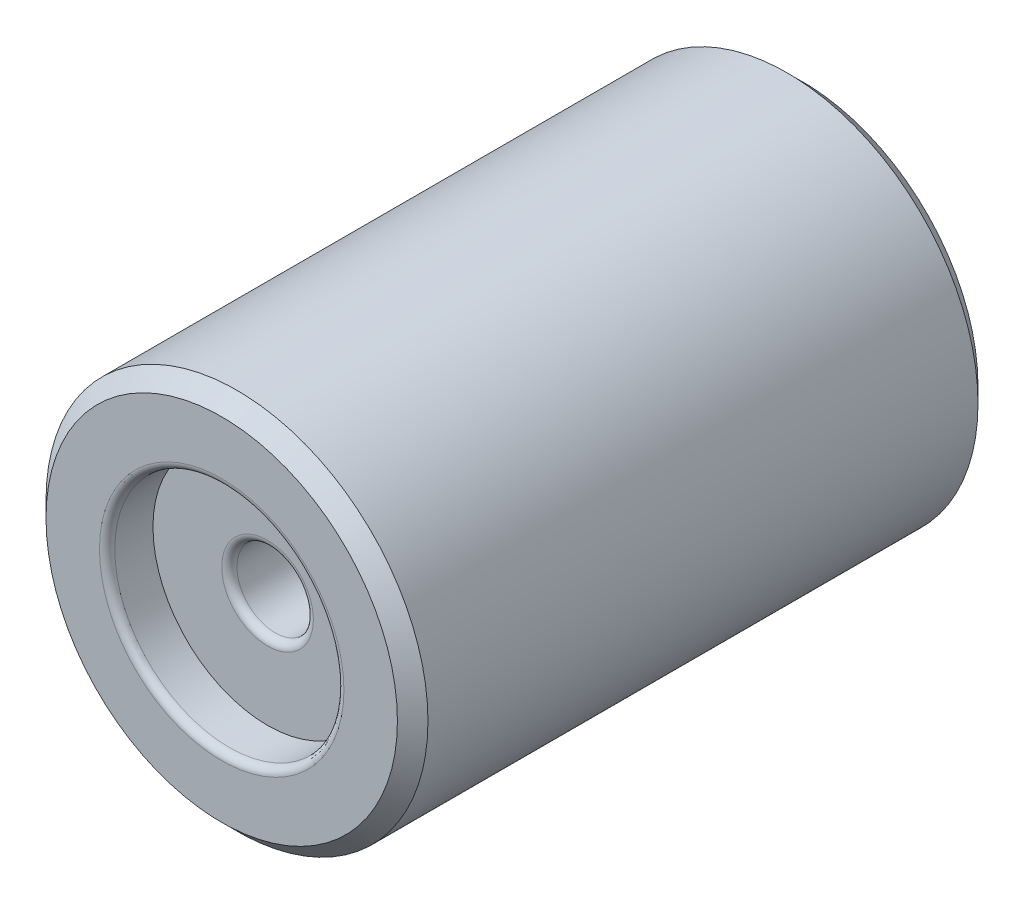
ISO-10303-21;
HEADER;
FILE_DESCRIPTION(('STEP AP214'),'2;1');
FILE_NAME('part.step','',(''),(''),'','','');
FILE_SCHEMA(('AUTOMOTIVE_DESIGN { 1 0 10303 214 1 1 1 1 }'));
ENDSEC;
DATA;
#1=APPLICATION_CONTEXT('core data for automotive mechanical design processes');
#2=APPLICATION_PROTOCOL_DEFINITION('international standard','automotive_design',2000,#1);
#3=PRODUCT_CONTEXT('',#1,'mechanical');
#4=PRODUCT('Part','Part','',(#3));
#5=PRODUCT_RELATED_PRODUCT_CATEGORY('part','',(#4));
#6=PRODUCT_DEFINITION_FORMATION('','',#4);
#7=PRODUCT_DEFINITION_CONTEXT('part definition',#1,'design');
#8=PRODUCT_DEFINITION('design','',#6,#7);
#9=PRODUCT_DEFINITION_SHAPE('','',#8);
#10=(LENGTH_UNIT() NAMED_UNIT(*) SI_UNIT(.MILLI.,.METRE.));
#11=(NAMED_UNIT(*) PLANE_ANGLE_UNIT() SI_UNIT($,.RADIAN.));
#12=(NAMED_UNIT(*) SI_UNIT($,.STERADIAN.) SOLID_ANGLE_UNIT());
#13=UNCERTAINTY_MEASURE_WITH_UNIT(LENGTH_MEASURE(1.E-05),#10,'distance_accuracy_value','');
#14=(GEOMETRIC_REPRESENTATION_CONTEXT(3) GLOBAL_UNCERTAINTY_ASSIGNED_CONTEXT((#13)) GLOBAL_UNIT_ASSIGNED_CONTEXT((#10,
#11,#12)) REPRESENTATION_CONTEXT('',''));
#15=CARTESIAN_POINT('',(0.,0.,0.));
#16=DIRECTION('',(0.,0.,1.));
#17=DIRECTION('',(1.,0.,0.));
#18=AXIS2_PLACEMENT_3D('',#15,#16,#17);
#19=CARTESIAN_POINT('',(0.,0.,19.));
#20=DIRECTION('',(0.,0.,-1.));
#21=DIRECTION('',(-1.,0.,0.));
#22=AXIS2_PLACEMENT_3D('',#19,#20,#21);
#23=CYLINDRICAL_SURFACE('',#22,7.5);
#24=CARTESIAN_POINT('',(0.,0.,-16.5));
#25=DIRECTION('',(0.,0.,1.));
#26=DIRECTION('',(1.,0.,0.));
#27=AXIS2_PLACEMENT_3D('',#24,#25,#26);
#28=CIRCLE('',#27,7.5);
#29=CARTESIAN_POINT('',(7.5,0.,-16.5));
#30=VERTEX_POINT('',#29);
#31=EDGE_CURVE('E65',#30,#30,#28,.T.);
#32=ORIENTED_EDGE('',*,*,#31,.T.);
#33=EDGE_LOOP('',(#32));
#34=FACE_BOUND('',#33,.T.);
#35=CARTESIAN_POINT('',(0.,0.,-18.5));
#36=DIRECTION('',(0.,0.,1.));
#37=DIRECTION('',(1.,0.,0.));
#38=AXIS2_PLACEMENT_3D('',#35,#36,#37);
#39=CIRCLE('',#38,7.5);
#40=CARTESIAN_POINT('',(7.5,0.,-18.5));
#41=VERTEX_POINT('',#40);
#42=EDGE_CURVE('E62',#41,#41,#39,.F.);
#43=ORIENTED_EDGE('',*,*,#42,.T.);
#44=EDGE_LOOP('',(#43));
#45=FACE_BOUND('',#44,.T.);
#46=ADVANCED_FACE('F39',(#34,#45),#23,.F.);
#47=CARTESIAN_POINT('',(0.,0.,18.5));
#48=DIRECTION('',(0.,0.,1.));
#49=DIRECTION('',(1.,0.,0.));
#50=AXIS2_PLACEMENT_3D('',#47,#48,#49);
#51=CIRCLE('',#50,7.5);
#52=CARTESIAN_POINT('',(7.5,0.,18.5));
#53=VERTEX_POINT('',#52);
#54=EDGE_CURVE('E53',#53,#53,#51,.T.);
#55=ORIENTED_EDGE('',*,*,#54,.T.);
#56=EDGE_LOOP('',(#55));
#57=FACE_BOUND('',#56,.T.);
#58=CARTESIAN_POINT('',(0.,0.,16.));
#59=DIRECTION('',(0.,0.,1.));
#60=DIRECTION('',(1.,0.,0.));
#61=AXIS2_PLACEMENT_3D('',#58,#59,#60);
#62=CIRCLE('',#61,7.5);
#63=CARTESIAN_POINT('',(7.5,0.,16.));
#64=VERTEX_POINT('',#63);
#65=EDGE_CURVE('E90',#64,#64,#62,.T.);
#66=ORIENTED_EDGE('',*,*,#65,.F.);
#67=EDGE_LOOP('',(#66));
#68=FACE_BOUND('',#67,.T.);
#69=ADVANCED_FACE('F92',(#57,#68),#23,.F.);
#70=CARTESIAN_POINT('',(0.,0.,19.));
#71=DIRECTION('',(0.,0.,-1.));
#72=DIRECTION('',(-1.,0.,0.));
#73=AXIS2_PLACEMENT_3D('',#70,#71,#72);
#74=CYLINDRICAL_SURFACE('',#73,12.5);
#75=CARTESIAN_POINT('',(0.,0.,18.));
#76=DIRECTION('',(0.,0.,1.));
#77=DIRECTION('',(1.,0.,0.));
#78=AXIS2_PLACEMENT_3D('',#75,#76,#77);
#79=CIRCLE('',#78,12.5);
#80=CARTESIAN_POINT('',(12.5,0.,18.));
#81=VERTEX_POINT('',#80);
#82=EDGE_CURVE('E77',#81,#81,#79,.F.);
#83=ORIENTED_EDGE('',*,*,#82,.T.);
#84=EDGE_LOOP('',(#83));
#85=FACE_BOUND('',#84,.T.);
#86=CARTESIAN_POINT('',(0.,0.,-18.));
#87=DIRECTION('',(0.,0.,1.));
#88=DIRECTION('',(1.,0.,0.));
#89=AXIS2_PLACEMENT_3D('',#86,#87,#88);
#90=CIRCLE('',#89,12.5);
#91=CARTESIAN_POINT('',(12.5,0.,-18.));
#92=VERTEX_POINT('',#91);
#93=EDGE_CURVE('E84',#92,#92,#90,.T.);
#94=ORIENTED_EDGE('',*,*,#93,.T.);
#95=EDGE_LOOP('',(#94));
#96=FACE_BOUND('',#95,.T.);
#97=ADVANCED_FACE('F100',(#85,#96),#74,.T.);
#98=CARTESIAN_POINT('',(0.,0.,19.));
#99=DIRECTION('',(0.,0.,1.));
#100=DIRECTION('',(1.,0.,0.));
#101=AXIS2_PLACEMENT_3D('',#98,#99,#100);
#102=PLANE('',#101);
#103=CARTESIAN_POINT('',(0.,0.,19.));
#104=DIRECTION('',(0.,0.,1.));
#105=DIRECTION('',(1.,0.,0.));
#106=AXIS2_PLACEMENT_3D('',#103,#104,#105);
#107=CIRCLE('',#106,8.);
#108=CARTESIAN_POINT('',(8.,0.,19.));
#109=VERTEX_POINT('',#108);
#110=EDGE_CURVE('E49',#109,#109,#107,.F.);
#111=ORIENTED_EDGE('',*,*,#110,.T.);
#112=EDGE_LOOP('',(#111));
#113=FACE_BOUND('',#112,.T.);
#114=CARTESIAN_POINT('',(0.,0.,19.));
#115=DIRECTION('',(0.,0.,1.));
#116=DIRECTION('',(1.,0.,0.));
#117=AXIS2_PLACEMENT_3D('',#114,#115,#116);
#118=CIRCLE('',#117,11.5);
#119=CARTESIAN_POINT('',(11.5,0.,19.));
#120=VERTEX_POINT('',#119);
#121=EDGE_CURVE('E88',#120,#120,#118,.T.);
#122=ORIENTED_EDGE('',*,*,#121,.T.);
#123=EDGE_LOOP('',(#122));
#124=FACE_BOUND('',#123,.T.);
#125=ADVANCED_FACE('F104',(#113,#124),#102,.T.);
#126=CARTESIAN_POINT('',(0.,0.,-19.));
#127=DIRECTION('',(0.,0.,1.));
#128=DIRECTION('',(1.,0.,0.));
#129=AXIS2_PLACEMENT_3D('',#126,#127,#128);
#130=PLANE('',#129);
#131=CARTESIAN_POINT('',(0.,0.,-19.));
#132=DIRECTION('',(0.,0.,1.));
#133=DIRECTION('',(1.,0.,0.));
#134=AXIS2_PLACEMENT_3D('',#131,#132,#133);
#135=CIRCLE('',#134,8.);
#136=CARTESIAN_POINT('',(8.,0.,-19.));
#137=VERTEX_POINT('',#136);
#138=EDGE_CURVE('E56',#137,#137,#135,.T.);
#139=ORIENTED_EDGE('',*,*,#138,.T.);
#140=EDGE_LOOP('',(#139));
#141=FACE_BOUND('',#140,.T.);
#142=CARTESIAN_POINT('',(0.,0.,-19.));
#143=DIRECTION('',(0.,0.,1.));
#144=DIRECTION('',(1.,0.,0.));
#145=AXIS2_PLACEMENT_3D('',#142,#143,#144);
#146=CIRCLE('',#145,11.5);
#147=CARTESIAN_POINT('',(11.5,0.,-19.));
#148=VERTEX_POINT('',#147);
#149=EDGE_CURVE('E80',#148,#148,#146,.F.);
#150=ORIENTED_EDGE('',*,*,#149,.T.);
#151=EDGE_LOOP('',(#150));
#152=FACE_BOUND('',#151,.T.);
#153=ADVANCED_FACE('F147',(#141,#152),#130,.F.);
#154=CARTESIAN_POINT('',(0.,0.,16.));
#155=DIRECTION('',(0.,0.,-1.));
#156=DIRECTION('',(-1.,0.,0.));
#157=AXIS2_PLACEMENT_3D('',#154,#155,#156);
#158=CYLINDRICAL_SURFACE('',#157,2.5);
#159=CARTESIAN_POINT('',(0.,0.,15.5));
#160=DIRECTION('',(0.,0.,1.));
#161=DIRECTION('',(1.,0.,0.));
#162=AXIS2_PLACEMENT_3D('',#159,#160,#161);
#163=CIRCLE('',#162,2.5);
#164=CARTESIAN_POINT('',(2.5,0.,15.5));
#165=VERTEX_POINT('',#164);
#166=EDGE_CURVE('E46',#165,#165,#163,.T.);
#167=ORIENTED_EDGE('',*,*,#166,.T.);
#168=EDGE_LOOP('',(#167));
#169=FACE_BOUND('',#168,.T.);
#170=CARTESIAN_POINT('',(0.,0.,-15.5));
#171=DIRECTION('',(0.,0.,1.));
#172=DIRECTION('',(1.,0.,0.));
#173=AXIS2_PLACEMENT_3D('',#170,#171,#172);
#174=CIRCLE('',#173,2.5);
#175=CARTESIAN_POINT('',(2.5,0.,-15.5));
#176=VERTEX_POINT('',#175);
#177=EDGE_CURVE('E66',#176,#176,#174,.F.);
#178=ORIENTED_EDGE('',*,*,#177,.T.);
#179=EDGE_LOOP('',(#178));
#180=FACE_BOUND('',#179,.T.);
#181=ADVANCED_FACE('F160',(#169,#180),#158,.F.);
#182=CARTESIAN_POINT('',(0.,0.,16.));
#183=DIRECTION('',(0.,0.,1.));
#184=DIRECTION('',(1.,0.,0.));
#185=AXIS2_PLACEMENT_3D('',#182,#183,#184);
#186=PLANE('',#185);
#187=CARTESIAN_POINT('',(0.,0.,16.));
#188=DIRECTION('',(0.,0.,1.));
#189=DIRECTION('',(1.,0.,0.));
#190=AXIS2_PLACEMENT_3D('',#187,#188,#189);
#191=CIRCLE('',#190,3.);
#192=CARTESIAN_POINT('',(3.,0.,16.));
#193=VERTEX_POINT('',#192);
#194=EDGE_CURVE('E10',#193,#193,#191,.F.);
#195=ORIENTED_EDGE('',*,*,#194,.T.);
#196=EDGE_LOOP('',(#195));
#197=FACE_BOUND('',#196,.T.);
#198=ORIENTED_EDGE('',*,*,#65,.T.);
#199=EDGE_LOOP('',(#198));
#200=FACE_BOUND('',#199,.T.);
#201=ADVANCED_FACE('F91',(#197,#200),#186,.T.);
#202=CARTESIAN_POINT('',(0.,0.,-16.));
#203=DIRECTION('',(0.,0.,1.));
#204=DIRECTION('',(1.,0.,0.));
#205=AXIS2_PLACEMENT_3D('',#202,#203,#204);
#206=PLANE('',#205);
#207=CARTESIAN_POINT('',(0.,0.,-16.));
#208=DIRECTION('',(0.,0.,1.));
#209=DIRECTION('',(1.,0.,0.));
#210=AXIS2_PLACEMENT_3D('',#207,#208,#209);
#211=CIRCLE('',#210,3.);
#212=CARTESIAN_POINT('',(3.,0.,-16.));
#213=VERTEX_POINT('',#212);
#214=EDGE_CURVE('E72',#213,#213,#211,.T.);
#215=ORIENTED_EDGE('',*,*,#214,.T.);
#216=EDGE_LOOP('',(#215));
#217=FACE_BOUND('',#216,.T.);
#218=CARTESIAN_POINT('',(0.,0.,-16.));
#219=DIRECTION('',(0.,0.,1.));
#220=DIRECTION('',(1.,0.,0.));
#221=AXIS2_PLACEMENT_3D('',#218,#219,#220);
#222=CIRCLE('',#221,7.);
#223=CARTESIAN_POINT('',(7.,0.,-16.));
#224=VERTEX_POINT('',#223);
#225=EDGE_CURVE('E74',#224,#224,#222,.F.);
#226=ORIENTED_EDGE('',*,*,#225,.T.);
#227=EDGE_LOOP('',(#226));
#228=FACE_BOUND('',#227,.T.);
#229=ADVANCED_FACE('F119',(#217,#228),#206,.F.);
#230=CARTESIAN_POINT('',(0.,0.,19.));
#231=DIRECTION('',(0.,0.,-1.));
#232=DIRECTION('',(-1.,0.,0.));
#233=AXIS2_PLACEMENT_3D('',#230,#231,#232);
#234=CONICAL_SURFACE('',#233,11.5,0.785398163397448);
#235=ORIENTED_EDGE('',*,*,#82,.F.);
#236=EDGE_LOOP('',(#235));
#237=FACE_BOUND('',#236,.T.);
#238=ORIENTED_EDGE('',*,*,#121,.F.);
#239=EDGE_LOOP('',(#238));
#240=FACE_BOUND('',#239,.T.);
#241=ADVANCED_FACE('F115',(#237,#240),#234,.T.);
#242=CARTESIAN_POINT('',(0.,0.,-18.));
#243=DIRECTION('',(0.,0.,1.));
#244=DIRECTION('',(1.,0.,0.));
#245=AXIS2_PLACEMENT_3D('',#242,#243,#244);
#246=CONICAL_SURFACE('',#245,12.5,0.785398163397452);
#247=ORIENTED_EDGE('',*,*,#149,.F.);
#248=EDGE_LOOP('',(#247));
#249=FACE_BOUND('',#248,.T.);
#250=ORIENTED_EDGE('',*,*,#93,.F.);
#251=EDGE_LOOP('',(#250));
#252=FACE_BOUND('',#251,.T.);
#253=ADVANCED_FACE('F116',(#249,#252),#246,.T.);
#254=CARTESIAN_POINT('',(0.,0.,-15.5));
#255=DIRECTION('',(0.,0.,1.));
#256=DIRECTION('',(1.,0.,0.));
#257=AXIS2_PLACEMENT_3D('',#254,#255,#256);
#258=TOROIDAL_SURFACE('',#257,3.,0.5);
#259=ORIENTED_EDGE('',*,*,#177,.F.);
#260=EDGE_LOOP('',(#259));
#261=FACE_BOUND('',#260,.T.);
#262=ORIENTED_EDGE('',*,*,#214,.F.);
#263=EDGE_LOOP('',(#262));
#264=FACE_BOUND('',#263,.T.);
#265=ADVANCED_FACE('F122',(#261,#264),#258,.T.);
#266=CARTESIAN_POINT('',(0.,0.,-16.5));
#267=DIRECTION('',(0.,0.,1.));
#268=DIRECTION('',(1.,0.,0.));
#269=AXIS2_PLACEMENT_3D('',#266,#267,#268);
#270=TOROIDAL_SURFACE('',#269,7.,0.5);
#271=ORIENTED_EDGE('',*,*,#225,.F.);
#272=EDGE_LOOP('',(#271));
#273=FACE_BOUND('',#272,.T.);
#274=ORIENTED_EDGE('',*,*,#31,.F.);
#275=EDGE_LOOP('',(#274));
#276=FACE_BOUND('',#275,.T.);
#277=ADVANCED_FACE('F129',(#273,#276),#270,.F.);
#278=CARTESIAN_POINT('',(0.,0.,-18.5));
#279=DIRECTION('',(0.,0.,1.));
#280=DIRECTION('',(1.,0.,0.));
#281=AXIS2_PLACEMENT_3D('',#278,#279,#280);
#282=TOROIDAL_SURFACE('',#281,8.,0.5);
#283=ORIENTED_EDGE('',*,*,#42,.F.);
#284=EDGE_LOOP('',(#283));
#285=FACE_BOUND('',#284,.T.);
#286=ORIENTED_EDGE('',*,*,#138,.F.);
#287=EDGE_LOOP('',(#286));
#288=FACE_BOUND('',#287,.T.);
#289=ADVANCED_FACE('F131',(#285,#288),#282,.T.);
#290=CARTESIAN_POINT('',(0.,0.,18.5));
#291=DIRECTION('',(0.,0.,1.));
#292=DIRECTION('',(1.,0.,0.));
#293=AXIS2_PLACEMENT_3D('',#290,#291,#292);
#294=TOROIDAL_SURFACE('',#293,8.,0.5);
#295=ORIENTED_EDGE('',*,*,#110,.F.);
#296=EDGE_LOOP('',(#295));
#297=FACE_BOUND('',#296,.T.);
#298=ORIENTED_EDGE('',*,*,#54,.F.);
#299=EDGE_LOOP('',(#298));
#300=FACE_BOUND('',#299,.T.);
#301=ADVANCED_FACE('F136',(#297,#300),#294,.T.);
#302=CARTESIAN_POINT('',(0.,0.,15.5));
#303=DIRECTION('',(0.,0.,1.));
#304=DIRECTION('',(1.,0.,0.));
#305=AXIS2_PLACEMENT_3D('',#302,#303,#304);
#306=TOROIDAL_SURFACE('',#305,3.,0.5);
#307=ORIENTED_EDGE('',*,*,#194,.F.);
#308=EDGE_LOOP('',(#307));
#309=FACE_BOUND('',#308,.T.);
#310=ORIENTED_EDGE('',*,*,#166,.F.);
#311=EDGE_LOOP('',(#310));
#312=FACE_BOUND('',#311,.T.);
#313=ADVANCED_FACE('F41',(#309,#312),#306,.T.);
#314=CLOSED_SHELL('',(#46,#69,#97,#125,#153,#181,#201,#229,#241,#253,#265,#277,#289,#301,#313));
#315=MANIFOLD_SOLID_BREP('B2',#314);
#316=ADVANCED_BREP_SHAPE_REPRESENTATION('',(#18,#315),#14);
#317=SHAPE_DEFINITION_REPRESENTATION(#9,#316);
ENDSEC;
END-ISO-10303-21;
